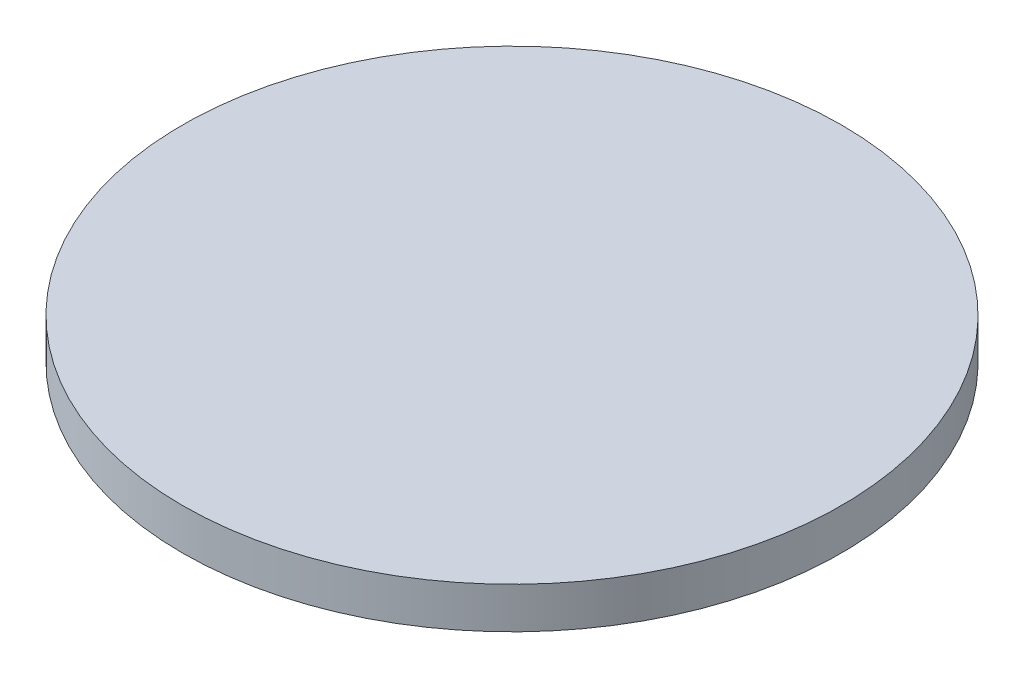
ISO-10303-21;
HEADER;
FILE_DESCRIPTION(('STEP AP214'),'2;1');
FILE_NAME('part.step','',(''),(''),'','','');
FILE_SCHEMA(('AUTOMOTIVE_DESIGN { 1 0 10303 214 1 1 1 1 }'));
ENDSEC;
DATA;
#1=APPLICATION_CONTEXT('core data for automotive mechanical design processes');
#2=APPLICATION_PROTOCOL_DEFINITION('international standard','automotive_design',2000,#1);
#3=PRODUCT_CONTEXT('',#1,'mechanical');
#4=PRODUCT('Part','Part','',(#3));
#5=PRODUCT_RELATED_PRODUCT_CATEGORY('part','',(#4));
#6=PRODUCT_DEFINITION_FORMATION('','',#4);
#7=PRODUCT_DEFINITION_CONTEXT('part definition',#1,'design');
#8=PRODUCT_DEFINITION('design','',#6,#7);
#9=PRODUCT_DEFINITION_SHAPE('','',#8);
#10=(LENGTH_UNIT() NAMED_UNIT(*) SI_UNIT(.MILLI.,.METRE.));
#11=(NAMED_UNIT(*) PLANE_ANGLE_UNIT() SI_UNIT($,.RADIAN.));
#12=(NAMED_UNIT(*) SI_UNIT($,.STERADIAN.) SOLID_ANGLE_UNIT());
#13=UNCERTAINTY_MEASURE_WITH_UNIT(LENGTH_MEASURE(1.E-05),#10,'distance_accuracy_value','');
#14=(GEOMETRIC_REPRESENTATION_CONTEXT(3) GLOBAL_UNCERTAINTY_ASSIGNED_CONTEXT((#13)) GLOBAL_UNIT_ASSIGNED_CONTEXT((#10,
#11,#12)) REPRESENTATION_CONTEXT('',''));
#15=CARTESIAN_POINT('',(0.,0.,0.));
#16=DIRECTION('',(0.,0.,1.));
#17=DIRECTION('',(1.,0.,0.));
#18=AXIS2_PLACEMENT_3D('',#15,#16,#17);
#19=CARTESIAN_POINT('',(0.,1.5,0.));
#20=DIRECTION('',(0.,-1.,0.));
#21=DIRECTION('',(0.,0.,-1.));
#22=AXIS2_PLACEMENT_3D('',#19,#20,#21);
#23=CYLINDRICAL_SURFACE('',#22,12.);
#24=CARTESIAN_POINT('',(0.,1.5,0.));
#25=DIRECTION('',(0.,1.,0.));
#26=DIRECTION('',(0.,0.,1.));
#27=AXIS2_PLACEMENT_3D('',#24,#25,#26);
#28=CIRCLE('',#27,12.);
#29=CARTESIAN_POINT('',(0.,1.5,12.));
#30=VERTEX_POINT('',#29);
#31=EDGE_CURVE('E10',#30,#30,#28,.T.);
#32=ORIENTED_EDGE('',*,*,#31,.F.);
#33=EDGE_LOOP('',(#32));
#34=FACE_BOUND('',#33,.T.);
#35=CARTESIAN_POINT('',(0.,0.,0.));
#36=DIRECTION('',(0.,1.,0.));
#37=DIRECTION('',(0.,0.,1.));
#38=AXIS2_PLACEMENT_3D('',#35,#36,#37);
#39=CIRCLE('',#38,12.);
#40=CARTESIAN_POINT('',(0.,0.,12.));
#41=VERTEX_POINT('',#40);
#42=EDGE_CURVE('E32',#41,#41,#39,.T.);
#43=ORIENTED_EDGE('',*,*,#42,.T.);
#44=EDGE_LOOP('',(#43));
#45=FACE_BOUND('',#44,.T.);
#46=ADVANCED_FACE('F29',(#34,#45),#23,.T.);
#47=CARTESIAN_POINT('',(0.,1.5,0.));
#48=DIRECTION('',(0.,1.,0.));
#49=DIRECTION('',(0.,0.,1.));
#50=AXIS2_PLACEMENT_3D('',#47,#48,#49);
#51=PLANE('',#50);
#52=ORIENTED_EDGE('',*,*,#31,.T.);
#53=EDGE_LOOP('',(#52));
#54=FACE_BOUND('',#53,.T.);
#55=ADVANCED_FACE('F44',(#54),#51,.T.);
#56=CARTESIAN_POINT('',(0.,0.,0.));
#57=DIRECTION('',(0.,1.,0.));
#58=DIRECTION('',(0.,0.,1.));
#59=AXIS2_PLACEMENT_3D('',#56,#57,#58);
#60=PLANE('',#59);
#61=ORIENTED_EDGE('',*,*,#42,.F.);
#62=EDGE_LOOP('',(#61));
#63=FACE_BOUND('',#62,.T.);
#64=ADVANCED_FACE('F42',(#63),#60,.F.);
#65=CLOSED_SHELL('',(#46,#55,#64));
#66=MANIFOLD_SOLID_BREP('B2',#65);
#67=ADVANCED_BREP_SHAPE_REPRESENTATION('',(#18,#66),#14);
#68=SHAPE_DEFINITION_REPRESENTATION(#9,#67);
ENDSEC;
END-ISO-10303-21;
